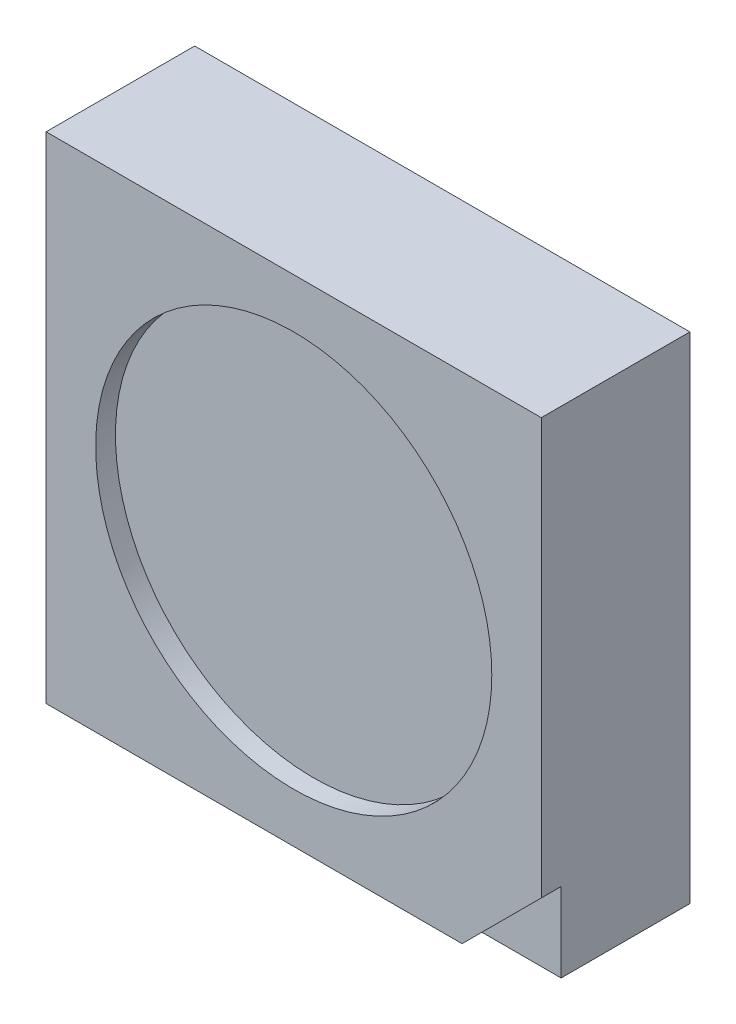
ISO-10303-21;
HEADER;
FILE_DESCRIPTION(('STEP AP214'),'2;1');
FILE_NAME('part.step','',(''),(''),'','','');
FILE_SCHEMA(('AUTOMOTIVE_DESIGN { 1 0 10303 214 1 1 1 1 }'));
ENDSEC;
DATA;
#1=APPLICATION_CONTEXT('core data for automotive mechanical design processes');
#2=APPLICATION_PROTOCOL_DEFINITION('international standard','automotive_design',2000,#1);
#3=PRODUCT_CONTEXT('',#1,'mechanical');
#4=PRODUCT('Part','Part','',(#3));
#5=PRODUCT_RELATED_PRODUCT_CATEGORY('part','',(#4));
#6=PRODUCT_DEFINITION_FORMATION('','',#4);
#7=PRODUCT_DEFINITION_CONTEXT('part definition',#1,'design');
#8=PRODUCT_DEFINITION('design','',#6,#7);
#9=PRODUCT_DEFINITION_SHAPE('','',#8);
#10=(LENGTH_UNIT() NAMED_UNIT(*) SI_UNIT(.MILLI.,.METRE.));
#11=(NAMED_UNIT(*) PLANE_ANGLE_UNIT() SI_UNIT($,.RADIAN.));
#12=(NAMED_UNIT(*) SI_UNIT($,.STERADIAN.) SOLID_ANGLE_UNIT());
#13=UNCERTAINTY_MEASURE_WITH_UNIT(LENGTH_MEASURE(1.E-05),#10,'distance_accuracy_value','');
#14=(GEOMETRIC_REPRESENTATION_CONTEXT(3) GLOBAL_UNCERTAINTY_ASSIGNED_CONTEXT((#13)) GLOBAL_UNIT_ASSIGNED_CONTEXT((#10,
#11,#12)) REPRESENTATION_CONTEXT('',''));
#15=CARTESIAN_POINT('',(0.,0.,0.));
#16=DIRECTION('',(0.,0.,1.));
#17=DIRECTION('',(1.,0.,0.));
#18=AXIS2_PLACEMENT_3D('',#15,#16,#17);
#19=CARTESIAN_POINT('',(2.5,-2.5,1.5));
#20=DIRECTION('',(-1.,0.,0.));
#21=DIRECTION('',(0.,0.,1.));
#22=AXIS2_PLACEMENT_3D('',#19,#20,#21);
#23=PLANE('',#22);
#24=DIRECTION('',(0.,1.,0.));
#25=VECTOR('',#24,1.);
#26=CARTESIAN_POINT('',(2.5,-2.5,1.5));
#27=LINE('',#26,#25);
#28=CARTESIAN_POINT('',(2.5,-1.7,1.5));
#29=VERTEX_POINT('',#28);
#30=CARTESIAN_POINT('',(2.5,2.5,1.5));
#31=VERTEX_POINT('',#30);
#32=EDGE_CURVE('E83',#29,#31,#27,.T.);
#33=ORIENTED_EDGE('',*,*,#32,.F.);
#34=DIRECTION('',(0.,0.,1.));
#35=VECTOR('',#34,1.);
#36=CARTESIAN_POINT('',(2.5,-1.7,1.3));
#37=LINE('',#36,#35);
#38=CARTESIAN_POINT('',(2.5,-1.7,1.3));
#39=VERTEX_POINT('',#38);
#40=EDGE_CURVE('E49',#39,#29,#37,.T.);
#41=ORIENTED_EDGE('',*,*,#40,.F.);
#42=DIRECTION('',(0.,1.,0.));
#43=VECTOR('',#42,1.);
#44=CARTESIAN_POINT('',(2.5,-1.7,1.3));
#45=LINE('',#44,#43);
#46=CARTESIAN_POINT('',(2.5,-2.5,1.3));
#47=VERTEX_POINT('',#46);
#48=EDGE_CURVE('E103',#47,#39,#45,.T.);
#49=ORIENTED_EDGE('',*,*,#48,.F.);
#50=DIRECTION('',(0.,0.,-1.));
#51=VECTOR('',#50,1.);
#52=CARTESIAN_POINT('',(2.5,-2.5,1.5));
#53=LINE('',#52,#51);
#54=CARTESIAN_POINT('',(2.5,-2.5,0.));
#55=VERTEX_POINT('',#54);
#56=EDGE_CURVE('E79',#47,#55,#53,.T.);
#57=ORIENTED_EDGE('',*,*,#56,.T.);
#58=DIRECTION('',(0.,1.,0.));
#59=VECTOR('',#58,1.);
#60=CARTESIAN_POINT('',(2.5,-2.5,0.));
#61=LINE('',#60,#59);
#62=CARTESIAN_POINT('',(2.5,2.5,0.));
#63=VERTEX_POINT('',#62);
#64=EDGE_CURVE('E118',#55,#63,#61,.T.);
#65=ORIENTED_EDGE('',*,*,#64,.T.);
#66=DIRECTION('',(0.,0.,-1.));
#67=VECTOR('',#66,1.);
#68=CARTESIAN_POINT('',(2.5,2.5,1.5));
#69=LINE('',#68,#67);
#70=EDGE_CURVE('E11',#31,#63,#69,.T.);
#71=ORIENTED_EDGE('',*,*,#70,.F.);
#72=EDGE_LOOP('',(#33,#41,#49,#57,#65,#71));
#73=FACE_BOUND('',#72,.T.);
#74=ADVANCED_FACE('F35',(#73),#23,.F.);
#75=CARTESIAN_POINT('',(-2.5,2.5,1.5));
#76=DIRECTION('',(0.,-1.,0.));
#77=DIRECTION('',(0.,0.,-1.));
#78=AXIS2_PLACEMENT_3D('',#75,#76,#77);
#79=PLANE('',#78);
#80=DIRECTION('',(-1.,0.,0.));
#81=VECTOR('',#80,1.);
#82=CARTESIAN_POINT('',(-2.5,2.5,0.));
#83=LINE('',#82,#81);
#84=CARTESIAN_POINT('',(-2.5,2.5,0.));
#85=VERTEX_POINT('',#84);
#86=EDGE_CURVE('E129',#63,#85,#83,.T.);
#87=ORIENTED_EDGE('',*,*,#86,.T.);
#88=DIRECTION('',(0.,0.,-1.));
#89=VECTOR('',#88,1.);
#90=CARTESIAN_POINT('',(-2.5,2.5,1.5));
#91=LINE('',#90,#89);
#92=CARTESIAN_POINT('',(-2.5,2.5,1.5));
#93=VERTEX_POINT('',#92);
#94=EDGE_CURVE('E42',#93,#85,#91,.T.);
#95=ORIENTED_EDGE('',*,*,#94,.F.);
#96=DIRECTION('',(-1.,0.,0.));
#97=VECTOR('',#96,1.);
#98=CARTESIAN_POINT('',(-2.5,2.5,1.5));
#99=LINE('',#98,#97);
#100=EDGE_CURVE('E122',#31,#93,#99,.T.);
#101=ORIENTED_EDGE('',*,*,#100,.F.);
#102=ORIENTED_EDGE('',*,*,#70,.T.);
#103=EDGE_LOOP('',(#87,#95,#101,#102));
#104=FACE_BOUND('',#103,.T.);
#105=ADVANCED_FACE('F164',(#104),#79,.F.);
#106=CARTESIAN_POINT('',(-2.5,-2.5,1.5));
#107=DIRECTION('',(1.,0.,0.));
#108=DIRECTION('',(0.,0.,-1.));
#109=AXIS2_PLACEMENT_3D('',#106,#107,#108);
#110=PLANE('',#109);
#111=DIRECTION('',(0.,-1.,0.));
#112=VECTOR('',#111,1.);
#113=CARTESIAN_POINT('',(-2.5,-2.5,0.));
#114=LINE('',#113,#112);
#115=CARTESIAN_POINT('',(-2.5,-2.5,0.));
#116=VERTEX_POINT('',#115);
#117=EDGE_CURVE('E131',#85,#116,#114,.T.);
#118=ORIENTED_EDGE('',*,*,#117,.T.);
#119=DIRECTION('',(0.,0.,-1.));
#120=VECTOR('',#119,1.);
#121=CARTESIAN_POINT('',(-2.5,-2.5,1.5));
#122=LINE('',#121,#120);
#123=CARTESIAN_POINT('',(-2.5,-2.5,1.5));
#124=VERTEX_POINT('',#123);
#125=EDGE_CURVE('E135',#124,#116,#122,.T.);
#126=ORIENTED_EDGE('',*,*,#125,.F.);
#127=DIRECTION('',(0.,-1.,0.));
#128=VECTOR('',#127,1.);
#129=CARTESIAN_POINT('',(-2.5,-2.5,1.5));
#130=LINE('',#129,#128);
#131=EDGE_CURVE('E58',#93,#124,#130,.T.);
#132=ORIENTED_EDGE('',*,*,#131,.F.);
#133=ORIENTED_EDGE('',*,*,#94,.T.);
#134=EDGE_LOOP('',(#118,#126,#132,#133));
#135=FACE_BOUND('',#134,.T.);
#136=ADVANCED_FACE('F141',(#135),#110,.F.);
#137=CARTESIAN_POINT('',(-2.5,-2.5,1.5));
#138=DIRECTION('',(0.,1.,0.));
#139=DIRECTION('',(0.,0.,1.));
#140=AXIS2_PLACEMENT_3D('',#137,#138,#139);
#141=PLANE('',#140);
#142=DIRECTION('',(1.,0.,0.));
#143=VECTOR('',#142,1.);
#144=CARTESIAN_POINT('',(2.5,-2.5,1.3));
#145=LINE('',#144,#143);
#146=CARTESIAN_POINT('',(1.7,-2.5,1.3));
#147=VERTEX_POINT('',#146);
#148=EDGE_CURVE('E102',#147,#47,#145,.T.);
#149=ORIENTED_EDGE('',*,*,#148,.F.);
#150=DIRECTION('',(0.,0.,1.));
#151=VECTOR('',#150,1.);
#152=CARTESIAN_POINT('',(1.7,-2.5,1.3));
#153=LINE('',#152,#151);
#154=CARTESIAN_POINT('',(1.7,-2.5,1.5));
#155=VERTEX_POINT('',#154);
#156=EDGE_CURVE('E99',#147,#155,#153,.T.);
#157=ORIENTED_EDGE('',*,*,#156,.T.);
#158=DIRECTION('',(1.,0.,0.));
#159=VECTOR('',#158,1.);
#160=CARTESIAN_POINT('',(-2.5,-2.5,1.5));
#161=LINE('',#160,#159);
#162=EDGE_CURVE('E126',#124,#155,#161,.T.);
#163=ORIENTED_EDGE('',*,*,#162,.F.);
#164=ORIENTED_EDGE('',*,*,#125,.T.);
#165=DIRECTION('',(1.,0.,0.));
#166=VECTOR('',#165,1.);
#167=CARTESIAN_POINT('',(-2.5,-2.5,0.));
#168=LINE('',#167,#166);
#169=EDGE_CURVE('E123',#116,#55,#168,.T.);
#170=ORIENTED_EDGE('',*,*,#169,.T.);
#171=ORIENTED_EDGE('',*,*,#56,.F.);
#172=EDGE_LOOP('',(#149,#157,#163,#164,#170,#171));
#173=FACE_BOUND('',#172,.T.);
#174=ADVANCED_FACE('F148',(#173),#141,.F.);
#175=CARTESIAN_POINT('',(0.,0.,1.5));
#176=DIRECTION('',(0.,0.,-1.));
#177=DIRECTION('',(-1.,0.,0.));
#178=AXIS2_PLACEMENT_3D('',#175,#176,#177);
#179=PLANE('',#178);
#180=CARTESIAN_POINT('',(0.,0.,1.5));
#181=DIRECTION('',(0.,0.,1.));
#182=DIRECTION('',(1.,0.,0.));
#183=AXIS2_PLACEMENT_3D('',#180,#181,#182);
#184=CIRCLE('',#183,2.);
#185=CARTESIAN_POINT('',(2.,0.,1.5));
#186=VERTEX_POINT('',#185);
#187=EDGE_CURVE('E110',#186,#186,#184,.T.);
#188=ORIENTED_EDGE('',*,*,#187,.F.);
#189=EDGE_LOOP('',(#188));
#190=FACE_BOUND('',#189,.T.);
#191=ORIENTED_EDGE('',*,*,#162,.T.);
#192=DIRECTION('',(-0.707106781186547,-0.707106781186547,0.));
#193=VECTOR('',#192,1.);
#194=CARTESIAN_POINT('',(1.7,-2.5,1.5));
#195=LINE('',#194,#193);
#196=EDGE_CURVE('E106',#29,#155,#195,.T.);
#197=ORIENTED_EDGE('',*,*,#196,.F.);
#198=ORIENTED_EDGE('',*,*,#32,.T.);
#199=ORIENTED_EDGE('',*,*,#100,.T.);
#200=ORIENTED_EDGE('',*,*,#131,.T.);
#201=EDGE_LOOP('',(#191,#197,#198,#199,#200));
#202=FACE_BOUND('',#201,.T.);
#203=ADVANCED_FACE('F150',(#190,#202),#179,.F.);
#204=CARTESIAN_POINT('',(0.,0.,0.));
#205=DIRECTION('',(0.,0.,-1.));
#206=DIRECTION('',(-1.,0.,0.));
#207=AXIS2_PLACEMENT_3D('',#204,#205,#206);
#208=PLANE('',#207);
#209=ORIENTED_EDGE('',*,*,#64,.F.);
#210=ORIENTED_EDGE('',*,*,#169,.F.);
#211=ORIENTED_EDGE('',*,*,#117,.F.);
#212=ORIENTED_EDGE('',*,*,#86,.F.);
#213=EDGE_LOOP('',(#209,#210,#211,#212));
#214=FACE_BOUND('',#213,.T.);
#215=ADVANCED_FACE('F146',(#214),#208,.T.);
#216=CARTESIAN_POINT('',(0.,0.,1.3));
#217=DIRECTION('',(0.,0.,1.));
#218=DIRECTION('',(1.,0.,0.));
#219=AXIS2_PLACEMENT_3D('',#216,#217,#218);
#220=CYLINDRICAL_SURFACE('',#219,2.);
#221=CARTESIAN_POINT('',(0.,0.,1.3));
#222=DIRECTION('',(0.,0.,1.));
#223=DIRECTION('',(1.,0.,0.));
#224=AXIS2_PLACEMENT_3D('',#221,#222,#223);
#225=CIRCLE('',#224,2.);
#226=CARTESIAN_POINT('',(2.,0.,1.3));
#227=VERTEX_POINT('',#226);
#228=EDGE_CURVE('E115',#227,#227,#225,.T.);
#229=ORIENTED_EDGE('',*,*,#228,.F.);
#230=EDGE_LOOP('',(#229));
#231=FACE_BOUND('',#230,.T.);
#232=ORIENTED_EDGE('',*,*,#187,.T.);
#233=EDGE_LOOP('',(#232));
#234=FACE_BOUND('',#233,.T.);
#235=ADVANCED_FACE('F158',(#231,#234),#220,.F.);
#236=CARTESIAN_POINT('',(0.,0.,1.3));
#237=DIRECTION('',(0.,0.,1.));
#238=DIRECTION('',(1.,0.,0.));
#239=AXIS2_PLACEMENT_3D('',#236,#237,#238);
#240=PLANE('',#239);
#241=ORIENTED_EDGE('',*,*,#228,.T.);
#242=EDGE_LOOP('',(#241));
#243=FACE_BOUND('',#242,.T.);
#244=ADVANCED_FACE('F195',(#243),#240,.T.);
#245=CARTESIAN_POINT('',(1.7,-2.5,1.3));
#246=DIRECTION('',(-0.707106781186548,0.707106781186548,0.));
#247=DIRECTION('',(-0.707106781186548,-0.707106781186548,0.));
#248=AXIS2_PLACEMENT_3D('',#245,#246,#247);
#249=PLANE('',#248);
#250=ORIENTED_EDGE('',*,*,#196,.T.);
#251=ORIENTED_EDGE('',*,*,#156,.F.);
#252=DIRECTION('',(-0.707106781186547,-0.707106781186547,0.));
#253=VECTOR('',#252,1.);
#254=CARTESIAN_POINT('',(1.7,-2.5,1.3));
#255=LINE('',#254,#253);
#256=EDGE_CURVE('E95',#39,#147,#255,.T.);
#257=ORIENTED_EDGE('',*,*,#256,.F.);
#258=ORIENTED_EDGE('',*,*,#40,.T.);
#259=EDGE_LOOP('',(#250,#251,#257,#258));
#260=FACE_BOUND('',#259,.T.);
#261=ADVANCED_FACE('F97',(#260),#249,.F.);
#262=CARTESIAN_POINT('',(0.,0.,1.3));
#263=DIRECTION('',(0.,0.,-1.));
#264=DIRECTION('',(-1.,0.,0.));
#265=AXIS2_PLACEMENT_3D('',#262,#263,#264);
#266=PLANE('',#265);
#267=ORIENTED_EDGE('',*,*,#48,.T.);
#268=ORIENTED_EDGE('',*,*,#256,.T.);
#269=ORIENTED_EDGE('',*,*,#148,.T.);
#270=EDGE_LOOP('',(#267,#268,#269));
#271=FACE_BOUND('',#270,.T.);
#272=ADVANCED_FACE('F105',(#271),#266,.F.);
#273=CLOSED_SHELL('',(#74,#105,#136,#174,#203,#215,#235,#244,#261,#272));
#274=MANIFOLD_SOLID_BREP('B2',#273);
#275=ADVANCED_BREP_SHAPE_REPRESENTATION('',(#18,#274),#14);
#276=SHAPE_DEFINITION_REPRESENTATION(#9,#275);
ENDSEC;
END-ISO-10303-21;
